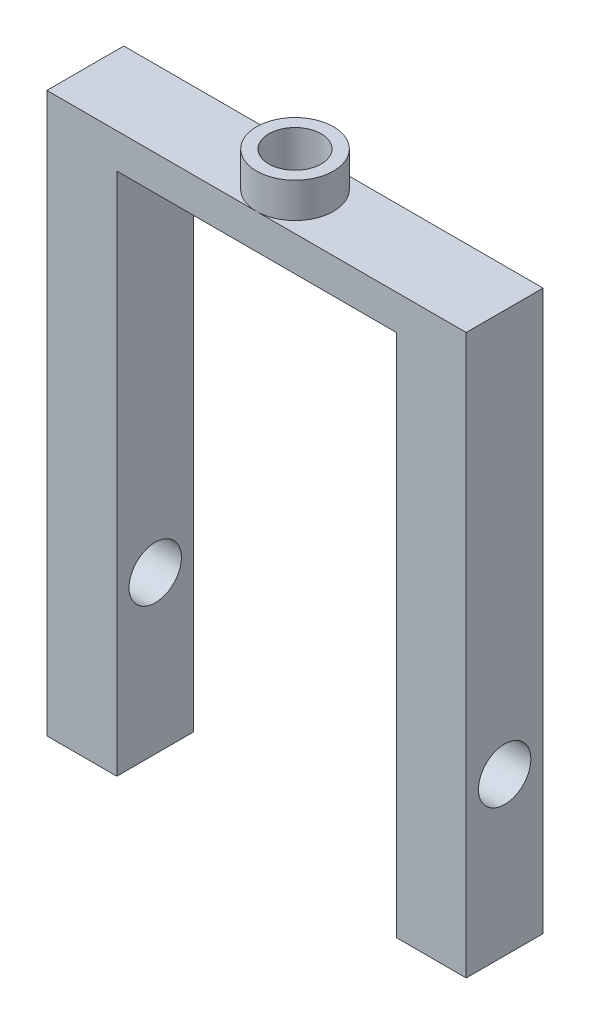
ISO-10303-21;
HEADER;
FILE_DESCRIPTION(('STEP AP214'),'2;1');
FILE_NAME('part.step','',(''),(''),'','','');
FILE_SCHEMA(('AUTOMOTIVE_DESIGN { 1 0 10303 214 1 1 1 1 }'));
ENDSEC;
DATA;
#1=APPLICATION_CONTEXT('core data for automotive mechanical design processes');
#2=APPLICATION_PROTOCOL_DEFINITION('international standard','automotive_design',2000,#1);
#3=PRODUCT_CONTEXT('',#1,'mechanical');
#4=PRODUCT('Part','Part','',(#3));
#5=PRODUCT_RELATED_PRODUCT_CATEGORY('part','',(#4));
#6=PRODUCT_DEFINITION_FORMATION('','',#4);
#7=PRODUCT_DEFINITION_CONTEXT('part definition',#1,'design');
#8=PRODUCT_DEFINITION('design','',#6,#7);
#9=PRODUCT_DEFINITION_SHAPE('','',#8);
#10=(LENGTH_UNIT() NAMED_UNIT(*) SI_UNIT(.MILLI.,.METRE.));
#11=(NAMED_UNIT(*) PLANE_ANGLE_UNIT() SI_UNIT($,.RADIAN.));
#12=(NAMED_UNIT(*) SI_UNIT($,.STERADIAN.) SOLID_ANGLE_UNIT());
#13=UNCERTAINTY_MEASURE_WITH_UNIT(LENGTH_MEASURE(1.E-05),#10,'distance_accuracy_value','');
#14=(GEOMETRIC_REPRESENTATION_CONTEXT(3) GLOBAL_UNCERTAINTY_ASSIGNED_CONTEXT((#13)) GLOBAL_UNIT_ASSIGNED_CONTEXT((#10,
#11,#12)) REPRESENTATION_CONTEXT('',''));
#15=CARTESIAN_POINT('',(0.,0.,0.));
#16=DIRECTION('',(0.,0.,1.));
#17=DIRECTION('',(1.,0.,0.));
#18=AXIS2_PLACEMENT_3D('',#15,#16,#17);
#19=CARTESIAN_POINT('',(0.,-107.95,0.));
#20=DIRECTION('',(0.,-1.,0.));
#21=DIRECTION('',(0.,0.,-1.));
#22=AXIS2_PLACEMENT_3D('',#19,#20,#21);
#23=PLANE('',#22);
#24=DIRECTION('',(0.,0.,-1.));
#25=VECTOR('',#24,1.);
#26=CARTESIAN_POINT('',(25.3999999999999,-107.95,6.98500000000001));
#27=LINE('',#26,#25);
#28=CARTESIAN_POINT('',(25.3999999999999,-107.95,6.98500000000001));
#29=VERTEX_POINT('',#28);
#30=CARTESIAN_POINT('',(25.3999999999999,-107.95,-6.985));
#31=VERTEX_POINT('',#30);
#32=EDGE_CURVE('E125',#29,#31,#27,.T.);
#33=ORIENTED_EDGE('',*,*,#32,.T.);
#34=DIRECTION('',(1.,0.,0.));
#35=VECTOR('',#34,1.);
#36=CARTESIAN_POINT('',(-38.1,-107.95,-6.98500000000001));
#37=LINE('',#36,#35);
#38=CARTESIAN_POINT('',(38.1,-107.95,-6.985));
#39=VERTEX_POINT('',#38);
#40=EDGE_CURVE('E154',#31,#39,#37,.T.);
#41=ORIENTED_EDGE('',*,*,#40,.T.);
#42=DIRECTION('',(0.,0.,1.));
#43=VECTOR('',#42,1.);
#44=CARTESIAN_POINT('',(38.1,-107.95,6.985));
#45=LINE('',#44,#43);
#46=CARTESIAN_POINT('',(38.1,-107.95,6.985));
#47=VERTEX_POINT('',#46);
#48=EDGE_CURVE('E146',#39,#47,#45,.T.);
#49=ORIENTED_EDGE('',*,*,#48,.T.);
#50=DIRECTION('',(-1.,0.,0.));
#51=VECTOR('',#50,1.);
#52=CARTESIAN_POINT('',(-38.1,-107.95,6.98499999999999));
#53=LINE('',#52,#51);
#54=EDGE_CURVE('E138',#47,#29,#53,.T.);
#55=ORIENTED_EDGE('',*,*,#54,.T.);
#56=EDGE_LOOP('',(#33,#41,#49,#55));
#57=FACE_BOUND('',#56,.T.);
#58=ADVANCED_FACE('F51',(#57),#23,.T.);
#59=CARTESIAN_POINT('',(0.,-6.35,0.));
#60=DIRECTION('',(0.,1.,0.));
#61=DIRECTION('',(0.,0.,1.));
#62=AXIS2_PLACEMENT_3D('',#59,#60,#61);
#63=CYLINDRICAL_SURFACE('',#62,6.985);
#64=CARTESIAN_POINT('',(0.,-6.35,0.));
#65=DIRECTION('',(0.,1.,0.));
#66=DIRECTION('',(0.,0.,1.));
#67=AXIS2_PLACEMENT_3D('',#64,#65,#66);
#68=CIRCLE('',#67,6.985);
#69=CARTESIAN_POINT('',(0.,-6.35,6.985));
#70=VERTEX_POINT('',#69);
#71=CARTESIAN_POINT('',(0.,-6.35,-6.985));
#72=VERTEX_POINT('',#71);
#73=EDGE_CURVE('E13',#70,#72,#68,.T.);
#74=ORIENTED_EDGE('',*,*,#73,.T.);
#75=EDGE_CURVE('E61',#72,#70,#68,.T.);
#76=ORIENTED_EDGE('',*,*,#75,.T.);
#77=EDGE_LOOP('',(#74,#76));
#78=FACE_BOUND('',#77,.T.);
#79=CARTESIAN_POINT('',(0.,0.,0.));
#80=DIRECTION('',(0.,1.,0.));
#81=DIRECTION('',(0.,0.,1.));
#82=AXIS2_PLACEMENT_3D('',#79,#80,#81);
#83=CIRCLE('',#82,6.985);
#84=CARTESIAN_POINT('',(0.,0.,6.985));
#85=VERTEX_POINT('',#84);
#86=EDGE_CURVE('E196',#85,#85,#83,.T.);
#87=ORIENTED_EDGE('',*,*,#86,.F.);
#88=EDGE_LOOP('',(#87));
#89=FACE_BOUND('',#88,.T.);
#90=ADVANCED_FACE('F53',(#78,#89),#63,.T.);
#91=CARTESIAN_POINT('',(0.,0.,0.));
#92=DIRECTION('',(0.,1.,0.));
#93=DIRECTION('',(0.,0.,1.));
#94=AXIS2_PLACEMENT_3D('',#91,#92,#93);
#95=PLANE('',#94);
#96=CARTESIAN_POINT('',(0.,0.,0.));
#97=DIRECTION('',(0.,1.,0.));
#98=DIRECTION('',(0.,0.,1.));
#99=AXIS2_PLACEMENT_3D('',#96,#97,#98);
#100=CIRCLE('',#99,4.7625);
#101=CARTESIAN_POINT('',(0.,0.,4.7625));
#102=VERTEX_POINT('',#101);
#103=EDGE_CURVE('E193',#102,#102,#100,.T.);
#104=ORIENTED_EDGE('',*,*,#103,.F.);
#105=EDGE_LOOP('',(#104));
#106=FACE_BOUND('',#105,.T.);
#107=ORIENTED_EDGE('',*,*,#86,.T.);
#108=EDGE_LOOP('',(#107));
#109=FACE_BOUND('',#108,.T.);
#110=ADVANCED_FACE('F285',(#106,#109),#95,.T.);
#111=CARTESIAN_POINT('',(0.,-63.5,0.));
#112=DIRECTION('',(0.,1.,0.));
#113=DIRECTION('',(0.,0.,1.));
#114=AXIS2_PLACEMENT_3D('',#111,#112,#113);
#115=CYLINDRICAL_SURFACE('',#114,4.7625);
#116=ORIENTED_EDGE('',*,*,#103,.T.);
#117=EDGE_LOOP('',(#116));
#118=FACE_BOUND('',#117,.T.);
#119=CARTESIAN_POINT('',(0.,-12.7,0.));
#120=DIRECTION('',(0.,1.,0.));
#121=DIRECTION('',(-1.,0.,0.));
#122=AXIS2_PLACEMENT_3D('',#119,#120,#121);
#123=CIRCLE('',#122,4.7625);
#124=CARTESIAN_POINT('',(-4.7625,-12.7,0.));
#125=VERTEX_POINT('',#124);
#126=EDGE_CURVE('E200',#125,#125,#123,.T.);
#127=ORIENTED_EDGE('',*,*,#126,.F.);
#128=EDGE_LOOP('',(#127));
#129=FACE_BOUND('',#128,.T.);
#130=ADVANCED_FACE('F293',(#118,#129),#115,.F.);
#131=CARTESIAN_POINT('',(0.,-6.35,0.));
#132=DIRECTION('',(0.,-1.,0.));
#133=DIRECTION('',(0.,0.,-1.));
#134=AXIS2_PLACEMENT_3D('',#131,#132,#133);
#135=PLANE('',#134);
#136=ORIENTED_EDGE('',*,*,#75,.F.);
#137=DIRECTION('',(1.,0.,0.));
#138=VECTOR('',#137,1.);
#139=CARTESIAN_POINT('',(-38.1,-6.35,-6.98500000000001));
#140=LINE('',#139,#138);
#141=CARTESIAN_POINT('',(-38.1,-6.35,-6.98500000000001));
#142=VERTEX_POINT('',#141);
#143=EDGE_CURVE('E175',#142,#72,#140,.T.);
#144=ORIENTED_EDGE('',*,*,#143,.F.);
#145=DIRECTION('',(0.,0.,-1.));
#146=VECTOR('',#145,1.);
#147=CARTESIAN_POINT('',(-38.1,-6.35,6.98499999999999));
#148=LINE('',#147,#146);
#149=CARTESIAN_POINT('',(-38.1,-6.35,6.98499999999999));
#150=VERTEX_POINT('',#149);
#151=EDGE_CURVE('E171',#150,#142,#148,.T.);
#152=ORIENTED_EDGE('',*,*,#151,.F.);
#153=DIRECTION('',(-1.,0.,0.));
#154=VECTOR('',#153,1.);
#155=CARTESIAN_POINT('',(-38.1,-6.35,6.98499999999999));
#156=LINE('',#155,#154);
#157=EDGE_CURVE('E167',#70,#150,#156,.T.);
#158=ORIENTED_EDGE('',*,*,#157,.F.);
#159=EDGE_LOOP('',(#136,#144,#152,#158));
#160=FACE_BOUND('',#159,.T.);
#161=ADVANCED_FACE('F255',(#160),#135,.F.);
#162=DIRECTION('',(0.,0.,-1.));
#163=VECTOR('',#162,1.);
#164=CARTESIAN_POINT('',(-25.4000000000001,-107.95,6.98500000000001));
#165=LINE('',#164,#163);
#166=CARTESIAN_POINT('',(-25.4000000000001,-107.95,6.98500000000001));
#167=VERTEX_POINT('',#166);
#168=CARTESIAN_POINT('',(-25.4000000000001,-107.95,-6.985));
#169=VERTEX_POINT('',#168);
#170=EDGE_CURVE('E135',#167,#169,#165,.T.);
#171=ORIENTED_EDGE('',*,*,#170,.F.);
#172=CARTESIAN_POINT('',(-38.1,-107.95,6.98499999999999));
#173=VERTEX_POINT('',#172);
#174=EDGE_CURVE('E150',#167,#173,#53,.T.);
#175=ORIENTED_EDGE('',*,*,#174,.T.);
#176=DIRECTION('',(0.,0.,-1.));
#177=VECTOR('',#176,1.);
#178=CARTESIAN_POINT('',(-38.1,-107.95,6.98499999999999));
#179=LINE('',#178,#177);
#180=CARTESIAN_POINT('',(-38.1,-107.95,-6.98500000000001));
#181=VERTEX_POINT('',#180);
#182=EDGE_CURVE('E149',#173,#181,#179,.T.);
#183=ORIENTED_EDGE('',*,*,#182,.T.);
#184=EDGE_CURVE('E158',#181,#169,#37,.T.);
#185=ORIENTED_EDGE('',*,*,#184,.T.);
#186=EDGE_LOOP('',(#171,#175,#183,#185));
#187=FACE_BOUND('',#186,.T.);
#188=ADVANCED_FACE('F246',(#187),#23,.T.);
#189=CARTESIAN_POINT('',(-38.1,-107.95,-6.98500000000001));
#190=DIRECTION('',(0.,0.,1.));
#191=DIRECTION('',(1.,0.,0.));
#192=AXIS2_PLACEMENT_3D('',#189,#190,#191);
#193=PLANE('',#192);
#194=ORIENTED_EDGE('',*,*,#40,.F.);
#195=DIRECTION('',(0.,-1.,0.));
#196=VECTOR('',#195,1.);
#197=CARTESIAN_POINT('',(25.3999999999999,-12.7,-6.985));
#198=LINE('',#197,#196);
#199=CARTESIAN_POINT('',(25.3999999999999,-12.7,-6.985));
#200=VERTEX_POINT('',#199);
#201=EDGE_CURVE('E130',#200,#31,#198,.T.);
#202=ORIENTED_EDGE('',*,*,#201,.F.);
#203=DIRECTION('',(1.,0.,0.));
#204=VECTOR('',#203,1.);
#205=CARTESIAN_POINT('',(-25.4000000000001,-12.7,-6.985));
#206=LINE('',#205,#204);
#207=CARTESIAN_POINT('',(-25.4000000000001,-12.7,-6.985));
#208=VERTEX_POINT('',#207);
#209=EDGE_CURVE('E143',#208,#200,#206,.T.);
#210=ORIENTED_EDGE('',*,*,#209,.F.);
#211=DIRECTION('',(0.,1.,0.));
#212=VECTOR('',#211,1.);
#213=CARTESIAN_POINT('',(-25.4000000000001,-12.7,-6.985));
#214=LINE('',#213,#212);
#215=EDGE_CURVE('E208',#169,#208,#214,.T.);
#216=ORIENTED_EDGE('',*,*,#215,.F.);
#217=ORIENTED_EDGE('',*,*,#184,.F.);
#218=DIRECTION('',(0.,1.,0.));
#219=VECTOR('',#218,1.);
#220=CARTESIAN_POINT('',(-38.1,-107.95,-6.98500000000001));
#221=LINE('',#220,#219);
#222=EDGE_CURVE('E182',#181,#142,#221,.T.);
#223=ORIENTED_EDGE('',*,*,#222,.T.);
#224=ORIENTED_EDGE('',*,*,#143,.T.);
#225=CARTESIAN_POINT('',(38.1,-6.35,-6.985));
#226=VERTEX_POINT('',#225);
#227=EDGE_CURVE('E174',#72,#226,#140,.T.);
#228=ORIENTED_EDGE('',*,*,#227,.T.);
#229=DIRECTION('',(0.,1.,0.));
#230=VECTOR('',#229,1.);
#231=CARTESIAN_POINT('',(38.1,-107.95,-6.985));
#232=LINE('',#231,#230);
#233=EDGE_CURVE('E162',#39,#226,#232,.T.);
#234=ORIENTED_EDGE('',*,*,#233,.F.);
#235=EDGE_LOOP('',(#194,#202,#210,#216,#217,#223,#224,#228,#234));
#236=FACE_BOUND('',#235,.T.);
#237=ADVANCED_FACE('F245',(#236),#193,.F.);
#238=CARTESIAN_POINT('',(-38.1,-107.95,6.98499999999999));
#239=DIRECTION('',(1.,0.,0.));
#240=DIRECTION('',(0.,0.,-1.));
#241=AXIS2_PLACEMENT_3D('',#238,#239,#240);
#242=PLANE('',#241);
#243=CARTESIAN_POINT('',(-38.1,-79.375,0.));
#244=DIRECTION('',(-1.,0.,0.));
#245=DIRECTION('',(0.,0.,1.));
#246=AXIS2_PLACEMENT_3D('',#243,#244,#245);
#247=CIRCLE('',#246,4.76249999999999);
#248=CARTESIAN_POINT('',(-38.1,-79.375,4.76249999999999));
#249=VERTEX_POINT('',#248);
#250=EDGE_CURVE('E305',#249,#249,#247,.T.);
#251=ORIENTED_EDGE('',*,*,#250,.F.);
#252=EDGE_LOOP('',(#251));
#253=FACE_BOUND('',#252,.T.);
#254=ORIENTED_EDGE('',*,*,#151,.T.);
#255=ORIENTED_EDGE('',*,*,#222,.F.);
#256=ORIENTED_EDGE('',*,*,#182,.F.);
#257=DIRECTION('',(0.,1.,0.));
#258=VECTOR('',#257,1.);
#259=CARTESIAN_POINT('',(-38.1,-107.95,6.98499999999999));
#260=LINE('',#259,#258);
#261=EDGE_CURVE('E186',#173,#150,#260,.T.);
#262=ORIENTED_EDGE('',*,*,#261,.T.);
#263=EDGE_LOOP('',(#254,#255,#256,#262));
#264=FACE_BOUND('',#263,.T.);
#265=ADVANCED_FACE('F251',(#253,#264),#242,.F.);
#266=CARTESIAN_POINT('',(-38.1,-107.95,6.98499999999999));
#267=DIRECTION('',(0.,0.,-1.));
#268=DIRECTION('',(-1.,0.,0.));
#269=AXIS2_PLACEMENT_3D('',#266,#267,#268);
#270=PLANE('',#269);
#271=DIRECTION('',(1.,0.,0.));
#272=VECTOR('',#271,1.);
#273=CARTESIAN_POINT('',(-25.4000000000001,-12.7,6.98500000000001));
#274=LINE('',#273,#272);
#275=CARTESIAN_POINT('',(-25.4000000000001,-12.7,6.985));
#276=VERTEX_POINT('',#275);
#277=CARTESIAN_POINT('',(25.3999999999999,-12.7,6.98500000000001));
#278=VERTEX_POINT('',#277);
#279=EDGE_CURVE('E69',#276,#278,#274,.T.);
#280=ORIENTED_EDGE('',*,*,#279,.T.);
#281=DIRECTION('',(0.,-1.,0.));
#282=VECTOR('',#281,1.);
#283=CARTESIAN_POINT('',(25.3999999999999,-12.7,6.98500000000001));
#284=LINE('',#283,#282);
#285=EDGE_CURVE('E128',#278,#29,#284,.T.);
#286=ORIENTED_EDGE('',*,*,#285,.T.);
#287=ORIENTED_EDGE('',*,*,#54,.F.);
#288=DIRECTION('',(0.,1.,0.));
#289=VECTOR('',#288,1.);
#290=CARTESIAN_POINT('',(38.1,-107.95,6.985));
#291=LINE('',#290,#289);
#292=CARTESIAN_POINT('',(38.1,-6.35,6.985));
#293=VERTEX_POINT('',#292);
#294=EDGE_CURVE('E190',#47,#293,#291,.T.);
#295=ORIENTED_EDGE('',*,*,#294,.T.);
#296=EDGE_CURVE('E77',#293,#70,#156,.T.);
#297=ORIENTED_EDGE('',*,*,#296,.T.);
#298=ORIENTED_EDGE('',*,*,#157,.T.);
#299=ORIENTED_EDGE('',*,*,#261,.F.);
#300=ORIENTED_EDGE('',*,*,#174,.F.);
#301=DIRECTION('',(0.,1.,0.));
#302=VECTOR('',#301,1.);
#303=CARTESIAN_POINT('',(-25.4000000000001,-12.7,6.98500000000001));
#304=LINE('',#303,#302);
#305=EDGE_CURVE('E142',#167,#276,#304,.T.);
#306=ORIENTED_EDGE('',*,*,#305,.T.);
#307=EDGE_LOOP('',(#280,#286,#287,#295,#297,#298,#299,#300,#306));
#308=FACE_BOUND('',#307,.T.);
#309=ADVANCED_FACE('F137',(#308),#270,.F.);
#310=CARTESIAN_POINT('',(38.1,-107.95,6.985));
#311=DIRECTION('',(-1.,0.,0.));
#312=DIRECTION('',(0.,0.,1.));
#313=AXIS2_PLACEMENT_3D('',#310,#311,#312);
#314=PLANE('',#313);
#315=CARTESIAN_POINT('',(38.1,-79.375,0.));
#316=DIRECTION('',(-1.,0.,0.));
#317=DIRECTION('',(0.,0.,1.));
#318=AXIS2_PLACEMENT_3D('',#315,#316,#317);
#319=CIRCLE('',#318,4.76249999999999);
#320=CARTESIAN_POINT('',(38.1,-79.375,4.7625));
#321=VERTEX_POINT('',#320);
#322=EDGE_CURVE('E203',#321,#321,#319,.F.);
#323=ORIENTED_EDGE('',*,*,#322,.F.);
#324=EDGE_LOOP('',(#323));
#325=FACE_BOUND('',#324,.T.);
#326=DIRECTION('',(0.,0.,1.));
#327=VECTOR('',#326,1.);
#328=CARTESIAN_POINT('',(38.1,-6.35,6.985));
#329=LINE('',#328,#327);
#330=EDGE_CURVE('E163',#226,#293,#329,.T.);
#331=ORIENTED_EDGE('',*,*,#330,.T.);
#332=ORIENTED_EDGE('',*,*,#294,.F.);
#333=ORIENTED_EDGE('',*,*,#48,.F.);
#334=ORIENTED_EDGE('',*,*,#233,.T.);
#335=EDGE_LOOP('',(#331,#332,#333,#334));
#336=FACE_BOUND('',#335,.T.);
#337=ADVANCED_FACE('F269',(#325,#336),#314,.F.);
#338=ORIENTED_EDGE('',*,*,#73,.F.);
#339=ORIENTED_EDGE('',*,*,#296,.F.);
#340=ORIENTED_EDGE('',*,*,#330,.F.);
#341=ORIENTED_EDGE('',*,*,#227,.F.);
#342=EDGE_LOOP('',(#338,#339,#340,#341));
#343=FACE_BOUND('',#342,.T.);
#344=ADVANCED_FACE('F263',(#343),#135,.F.);
#345=CARTESIAN_POINT('',(25.3999999999999,-12.7,6.98500000000001));
#346=DIRECTION('',(1.,0.,0.));
#347=DIRECTION('',(0.,0.,-1.));
#348=AXIS2_PLACEMENT_3D('',#345,#346,#347);
#349=PLANE('',#348);
#350=CARTESIAN_POINT('',(25.3999999999999,-79.375,0.));
#351=DIRECTION('',(1.,0.,0.));
#352=DIRECTION('',(0.,0.,-1.));
#353=AXIS2_PLACEMENT_3D('',#350,#351,#352);
#354=CIRCLE('',#353,4.76249999999999);
#355=CARTESIAN_POINT('',(25.3999999999999,-79.375,-4.76249999999999));
#356=VERTEX_POINT('',#355);
#357=EDGE_CURVE('E211',#356,#356,#354,.F.);
#358=ORIENTED_EDGE('',*,*,#357,.F.);
#359=EDGE_LOOP('',(#358));
#360=FACE_BOUND('',#359,.T.);
#361=ORIENTED_EDGE('',*,*,#201,.T.);
#362=ORIENTED_EDGE('',*,*,#32,.F.);
#363=ORIENTED_EDGE('',*,*,#285,.F.);
#364=DIRECTION('',(0.,0.,-1.));
#365=VECTOR('',#364,1.);
#366=CARTESIAN_POINT('',(25.3999999999999,-12.7,6.98500000000001));
#367=LINE('',#366,#365);
#368=EDGE_CURVE('E168',#278,#200,#367,.T.);
#369=ORIENTED_EDGE('',*,*,#368,.T.);
#370=EDGE_LOOP('',(#361,#362,#363,#369));
#371=FACE_BOUND('',#370,.T.);
#372=ADVANCED_FACE('F127',(#360,#371),#349,.F.);
#373=CARTESIAN_POINT('',(-25.4000000000001,-12.7,6.98500000000001));
#374=DIRECTION('',(0.,1.,0.));
#375=DIRECTION('',(-1.,0.,0.));
#376=AXIS2_PLACEMENT_3D('',#373,#374,#375);
#377=PLANE('',#376);
#378=ORIENTED_EDGE('',*,*,#126,.T.);
#379=EDGE_LOOP('',(#378));
#380=FACE_BOUND('',#379,.T.);
#381=ORIENTED_EDGE('',*,*,#209,.T.);
#382=ORIENTED_EDGE('',*,*,#368,.F.);
#383=ORIENTED_EDGE('',*,*,#279,.F.);
#384=DIRECTION('',(0.,0.,-1.));
#385=VECTOR('',#384,1.);
#386=CARTESIAN_POINT('',(-25.4000000000001,-12.7,6.98500000000001));
#387=LINE('',#386,#385);
#388=EDGE_CURVE('E232',#276,#208,#387,.T.);
#389=ORIENTED_EDGE('',*,*,#388,.T.);
#390=EDGE_LOOP('',(#381,#382,#383,#389));
#391=FACE_BOUND('',#390,.T.);
#392=ADVANCED_FACE('F315',(#380,#391),#377,.F.);
#393=CARTESIAN_POINT('',(-25.4000000000001,-12.7,6.98500000000001));
#394=DIRECTION('',(-1.,0.,0.));
#395=DIRECTION('',(0.,0.,1.));
#396=AXIS2_PLACEMENT_3D('',#393,#394,#395);
#397=PLANE('',#396);
#398=CARTESIAN_POINT('',(-25.4000000000001,-79.375,0.));
#399=DIRECTION('',(-1.,0.,0.));
#400=DIRECTION('',(0.,0.,1.));
#401=AXIS2_PLACEMENT_3D('',#398,#399,#400);
#402=CIRCLE('',#401,4.76249999999999);
#403=CARTESIAN_POINT('',(-25.4000000000001,-79.375,4.76249999999999));
#404=VERTEX_POINT('',#403);
#405=EDGE_CURVE('E55',#404,#404,#402,.F.);
#406=ORIENTED_EDGE('',*,*,#405,.F.);
#407=EDGE_LOOP('',(#406));
#408=FACE_BOUND('',#407,.T.);
#409=ORIENTED_EDGE('',*,*,#215,.T.);
#410=ORIENTED_EDGE('',*,*,#388,.F.);
#411=ORIENTED_EDGE('',*,*,#305,.F.);
#412=ORIENTED_EDGE('',*,*,#170,.T.);
#413=EDGE_LOOP('',(#409,#410,#411,#412));
#414=FACE_BOUND('',#413,.T.);
#415=ADVANCED_FACE('F239',(#408,#414),#397,.F.);
#416=CARTESIAN_POINT('',(-38.1,-79.375,0.));
#417=DIRECTION('',(1.,0.,0.));
#418=DIRECTION('',(0.,0.,-1.));
#419=AXIS2_PLACEMENT_3D('',#416,#417,#418);
#420=CYLINDRICAL_SURFACE('',#419,4.76249999999999);
#421=ORIENTED_EDGE('',*,*,#250,.T.);
#422=EDGE_LOOP('',(#421));
#423=FACE_BOUND('',#422,.T.);
#424=ORIENTED_EDGE('',*,*,#405,.T.);
#425=EDGE_LOOP('',(#424));
#426=FACE_BOUND('',#425,.T.);
#427=ADVANCED_FACE('F312',(#423,#426),#420,.F.);
#428=ORIENTED_EDGE('',*,*,#357,.T.);
#429=EDGE_LOOP('',(#428));
#430=FACE_BOUND('',#429,.T.);
#431=ORIENTED_EDGE('',*,*,#322,.T.);
#432=EDGE_LOOP('',(#431));
#433=FACE_BOUND('',#432,.T.);
#434=ADVANCED_FACE('F321',(#430,#433),#420,.F.);
#435=CLOSED_SHELL('',(#58,#90,#110,#130,#161,#188,#237,#265,#309,#337,#344,#372,#392,#415,#427,#434));
#436=MANIFOLD_SOLID_BREP('B2',#435);
#437=ADVANCED_BREP_SHAPE_REPRESENTATION('',(#18,#436),#14);
#438=SHAPE_DEFINITION_REPRESENTATION(#9,#437);
ENDSEC;
END-ISO-10303-21;
